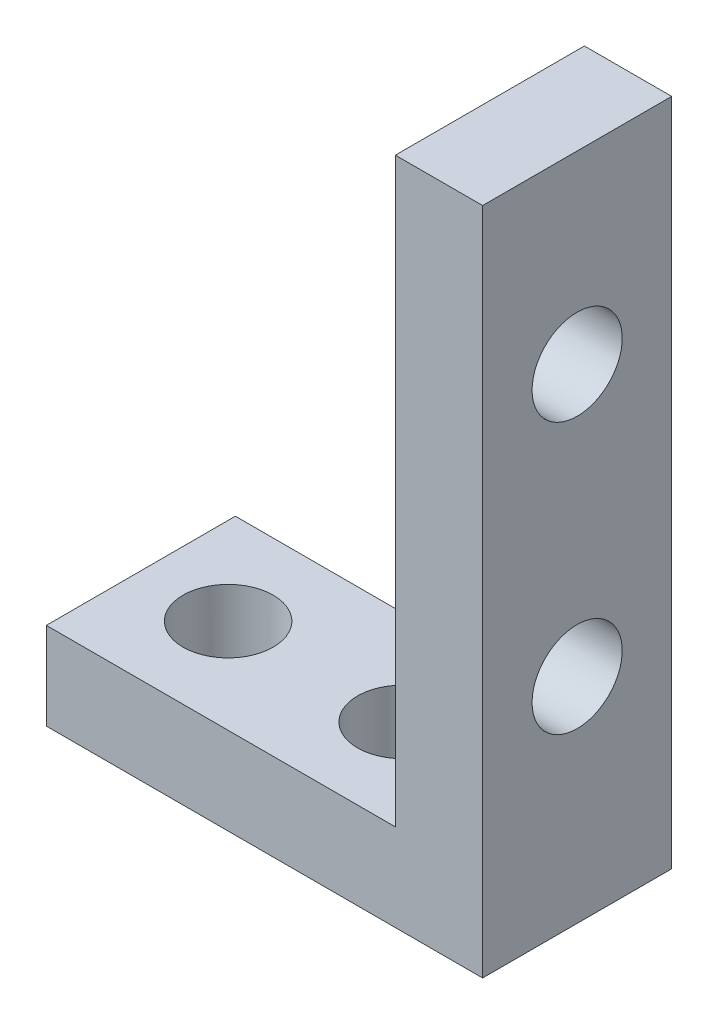
ISO-10303-21;
HEADER;
FILE_DESCRIPTION(('STEP AP214'),'2;1');
FILE_NAME('part.step','',(''),(''),'','','');
FILE_SCHEMA(('AUTOMOTIVE_DESIGN { 1 0 10303 214 1 1 1 1 }'));
ENDSEC;
DATA;
#1=APPLICATION_CONTEXT('core data for automotive mechanical design processes');
#2=APPLICATION_PROTOCOL_DEFINITION('international standard','automotive_design',2000,#1);
#3=PRODUCT_CONTEXT('',#1,'mechanical');
#4=PRODUCT('Part','Part','',(#3));
#5=PRODUCT_RELATED_PRODUCT_CATEGORY('part','',(#4));
#6=PRODUCT_DEFINITION_FORMATION('','',#4);
#7=PRODUCT_DEFINITION_CONTEXT('part definition',#1,'design');
#8=PRODUCT_DEFINITION('design','',#6,#7);
#9=PRODUCT_DEFINITION_SHAPE('','',#8);
#10=(LENGTH_UNIT() NAMED_UNIT(*) SI_UNIT(.MILLI.,.METRE.));
#11=(NAMED_UNIT(*) PLANE_ANGLE_UNIT() SI_UNIT($,.RADIAN.));
#12=(NAMED_UNIT(*) SI_UNIT($,.STERADIAN.) SOLID_ANGLE_UNIT());
#13=UNCERTAINTY_MEASURE_WITH_UNIT(LENGTH_MEASURE(1.E-05),#10,'distance_accuracy_value','');
#14=(GEOMETRIC_REPRESENTATION_CONTEXT(3) GLOBAL_UNCERTAINTY_ASSIGNED_CONTEXT((#13)) GLOBAL_UNIT_ASSIGNED_CONTEXT((#10,
#11,#12)) REPRESENTATION_CONTEXT('',''));
#15=CARTESIAN_POINT('',(0.,0.,0.));
#16=DIRECTION('',(0.,0.,1.));
#17=DIRECTION('',(1.,0.,0.));
#18=AXIS2_PLACEMENT_3D('',#15,#16,#17);
#19=CARTESIAN_POINT('',(-9.36185308848079,-5.625,6.5));
#20=DIRECTION('',(0.,1.,0.));
#21=DIRECTION('',(0.,0.,1.));
#22=AXIS2_PLACEMENT_3D('',#19,#20,#21);
#23=PLANE('',#22);
#24=DIRECTION('',(1.,0.,0.));
#25=VECTOR('',#24,1.);
#26=CARTESIAN_POINT('',(-9.36185308848079,-5.625,0.));
#27=LINE('',#26,#25);
#28=CARTESIAN_POINT('',(-21.3618530884808,-5.625,0.));
#29=VERTEX_POINT('',#28);
#30=CARTESIAN_POINT('',(-6.36185308848079,-5.625,0.));
#31=VERTEX_POINT('',#30);
#32=EDGE_CURVE('E123',#29,#31,#27,.T.);
#33=ORIENTED_EDGE('',*,*,#32,.T.);
#34=DIRECTION('',(0.,0.,-1.));
#35=VECTOR('',#34,1.);
#36=CARTESIAN_POINT('',(-6.36185308848079,-5.625,6.5));
#37=LINE('',#36,#35);
#38=CARTESIAN_POINT('',(-6.36185308848079,-5.625,6.5));
#39=VERTEX_POINT('',#38);
#40=EDGE_CURVE('E44',#39,#31,#37,.T.);
#41=ORIENTED_EDGE('',*,*,#40,.F.);
#42=DIRECTION('',(1.,0.,0.));
#43=VECTOR('',#42,1.);
#44=CARTESIAN_POINT('',(-21.3618530884808,-5.625,6.5));
#45=LINE('',#44,#43);
#46=CARTESIAN_POINT('',(-21.3618530884808,-5.625,6.5));
#47=VERTEX_POINT('',#46);
#48=EDGE_CURVE('E89',#47,#39,#45,.T.);
#49=ORIENTED_EDGE('',*,*,#48,.F.);
#50=DIRECTION('',(0.,0.,-1.));
#51=VECTOR('',#50,1.);
#52=CARTESIAN_POINT('',(-21.3618530884808,-5.625,6.5));
#53=LINE('',#52,#51);
#54=EDGE_CURVE('E11',#47,#29,#53,.T.);
#55=ORIENTED_EDGE('',*,*,#54,.T.);
#56=EDGE_LOOP('',(#33,#41,#49,#55));
#57=FACE_BOUND('',#56,.T.);
#58=CARTESIAN_POINT('',(-12.3618530884808,-5.625,3.25));
#59=DIRECTION('',(0.,1.,0.));
#60=DIRECTION('',(0.,0.,1.));
#61=AXIS2_PLACEMENT_3D('',#58,#59,#60);
#62=CIRCLE('',#61,1.55);
#63=CARTESIAN_POINT('',(-12.3618530884808,-5.625,4.8));
#64=VERTEX_POINT('',#63);
#65=EDGE_CURVE('E124',#64,#64,#62,.T.);
#66=ORIENTED_EDGE('',*,*,#65,.T.);
#67=EDGE_LOOP('',(#66));
#68=FACE_BOUND('',#67,.T.);
#69=CARTESIAN_POINT('',(-18.3618530884808,-5.625,3.25));
#70=DIRECTION('',(0.,1.,0.));
#71=DIRECTION('',(0.,0.,1.));
#72=AXIS2_PLACEMENT_3D('',#69,#70,#71);
#73=CIRCLE('',#72,1.55);
#74=CARTESIAN_POINT('',(-18.3618530884808,-5.625,4.8));
#75=VERTEX_POINT('',#74);
#76=EDGE_CURVE('E156',#75,#75,#73,.F.);
#77=ORIENTED_EDGE('',*,*,#76,.F.);
#78=EDGE_LOOP('',(#77));
#79=FACE_BOUND('',#78,.T.);
#80=ADVANCED_FACE('F35',(#57,#68,#79),#23,.F.);
#81=CARTESIAN_POINT('',(-21.3618530884808,-2.625,6.5));
#82=DIRECTION('',(0.,-1.,0.));
#83=DIRECTION('',(0.,0.,-1.));
#84=AXIS2_PLACEMENT_3D('',#81,#82,#83);
#85=PLANE('',#84);
#86=DIRECTION('',(-1.,0.,0.));
#87=VECTOR('',#86,1.);
#88=CARTESIAN_POINT('',(-21.3618530884808,-2.625,0.));
#89=LINE('',#88,#87);
#90=CARTESIAN_POINT('',(-9.36185308848079,-2.625,0.));
#91=VERTEX_POINT('',#90);
#92=CARTESIAN_POINT('',(-21.3618530884808,-2.625,0.));
#93=VERTEX_POINT('',#92);
#94=EDGE_CURVE('E81',#91,#93,#89,.T.);
#95=ORIENTED_EDGE('',*,*,#94,.T.);
#96=DIRECTION('',(0.,0.,-1.));
#97=VECTOR('',#96,1.);
#98=CARTESIAN_POINT('',(-21.3618530884808,-2.625,6.5));
#99=LINE('',#98,#97);
#100=CARTESIAN_POINT('',(-21.3618530884808,-2.625,6.5));
#101=VERTEX_POINT('',#100);
#102=EDGE_CURVE('E116',#101,#93,#99,.T.);
#103=ORIENTED_EDGE('',*,*,#102,.F.);
#104=DIRECTION('',(-1.,0.,0.));
#105=VECTOR('',#104,1.);
#106=CARTESIAN_POINT('',(-21.3618530884808,-2.625,6.5));
#107=LINE('',#106,#105);
#108=CARTESIAN_POINT('',(-9.36185308848079,-2.625,6.5));
#109=VERTEX_POINT('',#108);
#110=EDGE_CURVE('E52',#109,#101,#107,.T.);
#111=ORIENTED_EDGE('',*,*,#110,.F.);
#112=DIRECTION('',(0.,0.,-1.));
#113=VECTOR('',#112,1.);
#114=CARTESIAN_POINT('',(-9.36185308848079,-2.625,6.5));
#115=LINE('',#114,#113);
#116=EDGE_CURVE('E112',#109,#91,#115,.T.);
#117=ORIENTED_EDGE('',*,*,#116,.T.);
#118=EDGE_LOOP('',(#95,#103,#111,#117));
#119=FACE_BOUND('',#118,.T.);
#120=CARTESIAN_POINT('',(-12.3618530884808,-2.625,3.25));
#121=DIRECTION('',(0.,1.,0.));
#122=DIRECTION('',(0.,0.,1.));
#123=AXIS2_PLACEMENT_3D('',#120,#121,#122);
#124=CIRCLE('',#123,1.55);
#125=CARTESIAN_POINT('',(-12.3618530884808,-2.625,4.8));
#126=VERTEX_POINT('',#125);
#127=EDGE_CURVE('E151',#126,#126,#124,.T.);
#128=ORIENTED_EDGE('',*,*,#127,.F.);
#129=EDGE_LOOP('',(#128));
#130=FACE_BOUND('',#129,.T.);
#131=CARTESIAN_POINT('',(-18.3618530884808,-2.625,3.25));
#132=DIRECTION('',(0.,-1.,0.));
#133=DIRECTION('',(0.,0.,-1.));
#134=AXIS2_PLACEMENT_3D('',#131,#132,#133);
#135=CIRCLE('',#134,1.55);
#136=CARTESIAN_POINT('',(-18.3618530884808,-2.625,1.7));
#137=VERTEX_POINT('',#136);
#138=EDGE_CURVE('E154',#137,#137,#135,.T.);
#139=ORIENTED_EDGE('',*,*,#138,.T.);
#140=EDGE_LOOP('',(#139));
#141=FACE_BOUND('',#140,.T.);
#142=ADVANCED_FACE('F144',(#119,#130,#141),#85,.F.);
#143=CARTESIAN_POINT('',(-21.3618530884808,-2.625,6.5));
#144=DIRECTION('',(1.,0.,0.));
#145=DIRECTION('',(0.,0.,-1.));
#146=AXIS2_PLACEMENT_3D('',#143,#144,#145);
#147=PLANE('',#146);
#148=DIRECTION('',(0.,-1.,0.));
#149=VECTOR('',#148,1.);
#150=CARTESIAN_POINT('',(-21.3618530884808,-2.625,0.));
#151=LINE('',#150,#149);
#152=EDGE_CURVE('E120',#93,#29,#151,.T.);
#153=ORIENTED_EDGE('',*,*,#152,.T.);
#154=ORIENTED_EDGE('',*,*,#54,.F.);
#155=DIRECTION('',(0.,-1.,0.));
#156=VECTOR('',#155,1.);
#157=CARTESIAN_POINT('',(-21.3618530884808,-2.625,6.5));
#158=LINE('',#157,#156);
#159=EDGE_CURVE('E131',#101,#47,#158,.T.);
#160=ORIENTED_EDGE('',*,*,#159,.F.);
#161=ORIENTED_EDGE('',*,*,#102,.T.);
#162=EDGE_LOOP('',(#153,#154,#160,#161));
#163=FACE_BOUND('',#162,.T.);
#164=ADVANCED_FACE('F37',(#163),#147,.F.);
#165=CARTESIAN_POINT('',(-6.36185308848079,-5.625,6.5));
#166=DIRECTION('',(-1.,0.,0.));
#167=DIRECTION('',(0.,0.,1.));
#168=AXIS2_PLACEMENT_3D('',#165,#166,#167);
#169=PLANE('',#168);
#170=CARTESIAN_POINT('',(-6.36185308848079,11.025,3.25));
#171=DIRECTION('',(-1.,0.,0.));
#172=DIRECTION('',(0.,0.,1.));
#173=AXIS2_PLACEMENT_3D('',#170,#171,#172);
#174=CIRCLE('',#173,1.55);
#175=CARTESIAN_POINT('',(-6.36185308848079,11.025,4.8));
#176=VERTEX_POINT('',#175);
#177=EDGE_CURVE('E258',#176,#176,#174,.T.);
#178=ORIENTED_EDGE('',*,*,#177,.T.);
#179=EDGE_LOOP('',(#178));
#180=FACE_BOUND('',#179,.T.);
#181=CARTESIAN_POINT('',(-6.36185308848079,1.725,3.25));
#182=DIRECTION('',(-1.,0.,0.));
#183=DIRECTION('',(0.,0.,1.));
#184=AXIS2_PLACEMENT_3D('',#181,#182,#183);
#185=CIRCLE('',#184,1.55);
#186=CARTESIAN_POINT('',(-6.36185308848079,1.725,4.8));
#187=VERTEX_POINT('',#186);
#188=EDGE_CURVE('E157',#187,#187,#185,.T.);
#189=ORIENTED_EDGE('',*,*,#188,.T.);
#190=EDGE_LOOP('',(#189));
#191=FACE_BOUND('',#190,.T.);
#192=DIRECTION('',(0.,1.,0.));
#193=VECTOR('',#192,1.);
#194=CARTESIAN_POINT('',(-6.36185308848079,-5.625,0.));
#195=LINE('',#194,#193);
#196=CARTESIAN_POINT('',(-6.36185308848079,17.375,0.));
#197=VERTEX_POINT('',#196);
#198=EDGE_CURVE('E126',#31,#197,#195,.T.);
#199=ORIENTED_EDGE('',*,*,#198,.T.);
#200=DIRECTION('',(0.,0.,-1.));
#201=VECTOR('',#200,1.);
#202=CARTESIAN_POINT('',(-6.36185308848079,17.375,6.5));
#203=LINE('',#202,#201);
#204=CARTESIAN_POINT('',(-6.36185308848079,17.375,6.5));
#205=VERTEX_POINT('',#204);
#206=EDGE_CURVE('E111',#205,#197,#203,.T.);
#207=ORIENTED_EDGE('',*,*,#206,.F.);
#208=DIRECTION('',(0.,1.,0.));
#209=VECTOR('',#208,1.);
#210=CARTESIAN_POINT('',(-6.36185308848079,-5.625,6.5));
#211=LINE('',#210,#209);
#212=EDGE_CURVE('E102',#39,#205,#211,.T.);
#213=ORIENTED_EDGE('',*,*,#212,.F.);
#214=ORIENTED_EDGE('',*,*,#40,.T.);
#215=EDGE_LOOP('',(#199,#207,#213,#214));
#216=FACE_BOUND('',#215,.T.);
#217=ADVANCED_FACE('F137',(#180,#191,#216),#169,.F.);
#218=CARTESIAN_POINT('',(-9.36185308848079,17.375,6.5));
#219=DIRECTION('',(0.,-1.,0.));
#220=DIRECTION('',(0.,0.,-1.));
#221=AXIS2_PLACEMENT_3D('',#218,#219,#220);
#222=PLANE('',#221);
#223=DIRECTION('',(-1.,0.,0.));
#224=VECTOR('',#223,1.);
#225=CARTESIAN_POINT('',(-9.36185308848079,17.375,0.));
#226=LINE('',#225,#224);
#227=CARTESIAN_POINT('',(-9.36185308848079,17.375,0.));
#228=VERTEX_POINT('',#227);
#229=EDGE_CURVE('E110',#197,#228,#226,.T.);
#230=ORIENTED_EDGE('',*,*,#229,.T.);
#231=DIRECTION('',(0.,0.,-1.));
#232=VECTOR('',#231,1.);
#233=CARTESIAN_POINT('',(-9.36185308848079,17.375,6.5));
#234=LINE('',#233,#232);
#235=CARTESIAN_POINT('',(-9.36185308848079,17.375,6.5));
#236=VERTEX_POINT('',#235);
#237=EDGE_CURVE('E107',#236,#228,#234,.T.);
#238=ORIENTED_EDGE('',*,*,#237,.F.);
#239=DIRECTION('',(-1.,0.,0.));
#240=VECTOR('',#239,1.);
#241=CARTESIAN_POINT('',(-9.36185308848079,17.375,6.5));
#242=LINE('',#241,#240);
#243=EDGE_CURVE('E96',#205,#236,#242,.T.);
#244=ORIENTED_EDGE('',*,*,#243,.F.);
#245=ORIENTED_EDGE('',*,*,#206,.T.);
#246=EDGE_LOOP('',(#230,#238,#244,#245));
#247=FACE_BOUND('',#246,.T.);
#248=ADVANCED_FACE('F108',(#247),#222,.F.);
#249=CARTESIAN_POINT('',(-9.36185308848079,-2.625,6.5));
#250=DIRECTION('',(1.,0.,0.));
#251=DIRECTION('',(0.,0.,-1.));
#252=AXIS2_PLACEMENT_3D('',#249,#250,#251);
#253=PLANE('',#252);
#254=CARTESIAN_POINT('',(-9.36185308848079,11.025,3.25));
#255=DIRECTION('',(-1.,0.,0.));
#256=DIRECTION('',(0.,0.,1.));
#257=AXIS2_PLACEMENT_3D('',#254,#255,#256);
#258=CIRCLE('',#257,1.55);
#259=CARTESIAN_POINT('',(-9.36185308848079,11.025,4.8));
#260=VERTEX_POINT('',#259);
#261=EDGE_CURVE('E255',#260,#260,#258,.T.);
#262=ORIENTED_EDGE('',*,*,#261,.F.);
#263=EDGE_LOOP('',(#262));
#264=FACE_BOUND('',#263,.T.);
#265=CARTESIAN_POINT('',(-9.36185308848079,1.725,3.25));
#266=DIRECTION('',(-1.,0.,0.));
#267=DIRECTION('',(0.,0.,1.));
#268=AXIS2_PLACEMENT_3D('',#265,#266,#267);
#269=CIRCLE('',#268,1.55);
#270=CARTESIAN_POINT('',(-9.36185308848079,1.725,4.8));
#271=VERTEX_POINT('',#270);
#272=EDGE_CURVE('E162',#271,#271,#269,.T.);
#273=ORIENTED_EDGE('',*,*,#272,.F.);
#274=EDGE_LOOP('',(#273));
#275=FACE_BOUND('',#274,.T.);
#276=DIRECTION('',(0.,-1.,0.));
#277=VECTOR('',#276,1.);
#278=CARTESIAN_POINT('',(-9.36185308848079,-2.625,0.));
#279=LINE('',#278,#277);
#280=EDGE_CURVE('E75',#228,#91,#279,.T.);
#281=ORIENTED_EDGE('',*,*,#280,.T.);
#282=ORIENTED_EDGE('',*,*,#116,.F.);
#283=DIRECTION('',(0.,-1.,0.));
#284=VECTOR('',#283,1.);
#285=CARTESIAN_POINT('',(-9.36185308848079,-2.625,6.5));
#286=LINE('',#285,#284);
#287=EDGE_CURVE('E100',#236,#109,#286,.T.);
#288=ORIENTED_EDGE('',*,*,#287,.F.);
#289=ORIENTED_EDGE('',*,*,#237,.T.);
#290=EDGE_LOOP('',(#281,#282,#288,#289));
#291=FACE_BOUND('',#290,.T.);
#292=ADVANCED_FACE('F114',(#264,#275,#291),#253,.F.);
#293=CARTESIAN_POINT('',(0.,0.,6.5));
#294=DIRECTION('',(0.,0.,1.));
#295=DIRECTION('',(1.,0.,0.));
#296=AXIS2_PLACEMENT_3D('',#293,#294,#295);
#297=PLANE('',#296);
#298=ORIENTED_EDGE('',*,*,#159,.T.);
#299=ORIENTED_EDGE('',*,*,#48,.T.);
#300=ORIENTED_EDGE('',*,*,#212,.T.);
#301=ORIENTED_EDGE('',*,*,#243,.T.);
#302=ORIENTED_EDGE('',*,*,#287,.T.);
#303=ORIENTED_EDGE('',*,*,#110,.T.);
#304=EDGE_LOOP('',(#298,#299,#300,#301,#302,#303));
#305=FACE_BOUND('',#304,.T.);
#306=ADVANCED_FACE('F98',(#305),#297,.T.);
#307=CARTESIAN_POINT('',(0.,0.,0.));
#308=DIRECTION('',(0.,0.,1.));
#309=DIRECTION('',(1.,0.,0.));
#310=AXIS2_PLACEMENT_3D('',#307,#308,#309);
#311=PLANE('',#310);
#312=ORIENTED_EDGE('',*,*,#152,.F.);
#313=ORIENTED_EDGE('',*,*,#94,.F.);
#314=ORIENTED_EDGE('',*,*,#280,.F.);
#315=ORIENTED_EDGE('',*,*,#229,.F.);
#316=ORIENTED_EDGE('',*,*,#198,.F.);
#317=ORIENTED_EDGE('',*,*,#32,.F.);
#318=EDGE_LOOP('',(#312,#313,#314,#315,#316,#317));
#319=FACE_BOUND('',#318,.T.);
#320=ADVANCED_FACE('F140',(#319),#311,.F.);
#321=CARTESIAN_POINT('',(-12.3618530884808,-12.625,3.25));
#322=DIRECTION('',(0.,1.,0.));
#323=DIRECTION('',(0.,0.,1.));
#324=AXIS2_PLACEMENT_3D('',#321,#322,#323);
#325=CYLINDRICAL_SURFACE('',#324,1.55);
#326=ORIENTED_EDGE('',*,*,#127,.T.);
#327=EDGE_LOOP('',(#326));
#328=FACE_BOUND('',#327,.T.);
#329=ORIENTED_EDGE('',*,*,#65,.F.);
#330=EDGE_LOOP('',(#329));
#331=FACE_BOUND('',#330,.T.);
#332=ADVANCED_FACE('F174',(#328,#331),#325,.F.);
#333=CARTESIAN_POINT('',(-18.3618530884808,-12.625,3.25));
#334=DIRECTION('',(0.,1.,0.));
#335=DIRECTION('',(0.,0.,1.));
#336=AXIS2_PLACEMENT_3D('',#333,#334,#335);
#337=CYLINDRICAL_SURFACE('',#336,1.55);
#338=ORIENTED_EDGE('',*,*,#138,.F.);
#339=EDGE_LOOP('',(#338));
#340=FACE_BOUND('',#339,.T.);
#341=ORIENTED_EDGE('',*,*,#76,.T.);
#342=EDGE_LOOP('',(#341));
#343=FACE_BOUND('',#342,.T.);
#344=ADVANCED_FACE('F176',(#340,#343),#337,.F.);
#345=CARTESIAN_POINT('',(0.638146911519215,1.725,3.25));
#346=DIRECTION('',(-1.,0.,0.));
#347=DIRECTION('',(0.,0.,1.));
#348=AXIS2_PLACEMENT_3D('',#345,#346,#347);
#349=CYLINDRICAL_SURFACE('',#348,1.55);
#350=ORIENTED_EDGE('',*,*,#272,.T.);
#351=EDGE_LOOP('',(#350));
#352=FACE_BOUND('',#351,.T.);
#353=ORIENTED_EDGE('',*,*,#188,.F.);
#354=EDGE_LOOP('',(#353));
#355=FACE_BOUND('',#354,.T.);
#356=ADVANCED_FACE('F183',(#352,#355),#349,.F.);
#357=CARTESIAN_POINT('',(0.638146911519215,11.025,3.25));
#358=DIRECTION('',(-1.,0.,0.));
#359=DIRECTION('',(0.,0.,1.));
#360=AXIS2_PLACEMENT_3D('',#357,#358,#359);
#361=CYLINDRICAL_SURFACE('',#360,1.55);
#362=ORIENTED_EDGE('',*,*,#261,.T.);
#363=EDGE_LOOP('',(#362));
#364=FACE_BOUND('',#363,.T.);
#365=ORIENTED_EDGE('',*,*,#177,.F.);
#366=EDGE_LOOP('',(#365));
#367=FACE_BOUND('',#366,.T.);
#368=ADVANCED_FACE('F238',(#364,#367),#361,.F.);
#369=CLOSED_SHELL('',(#80,#142,#164,#217,#248,#292,#306,#320,#332,#344,#356,#368));
#370=MANIFOLD_SOLID_BREP('B2',#369);
#371=ADVANCED_BREP_SHAPE_REPRESENTATION('',(#18,#370),#14);
#372=SHAPE_DEFINITION_REPRESENTATION(#9,#371);
ENDSEC;
END-ISO-10303-21;
